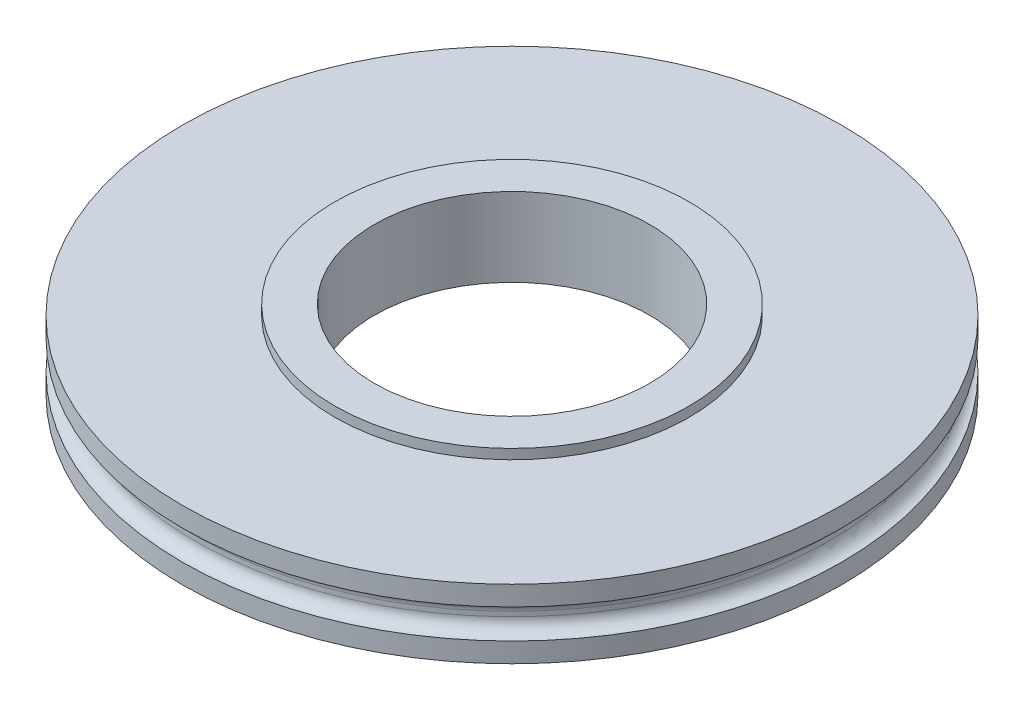
ISO-10303-21;
HEADER;
FILE_DESCRIPTION(('STEP AP214'),'2;1');
FILE_NAME('part.step','',(''),(''),'','','');
FILE_SCHEMA(('AUTOMOTIVE_DESIGN { 1 0 10303 214 1 1 1 1 }'));
ENDSEC;
DATA;
#1=APPLICATION_CONTEXT('core data for automotive mechanical design processes');
#2=APPLICATION_PROTOCOL_DEFINITION('international standard','automotive_design',2000,#1);
#3=PRODUCT_CONTEXT('',#1,'mechanical');
#4=PRODUCT('Part','Part','',(#3));
#5=PRODUCT_RELATED_PRODUCT_CATEGORY('part','',(#4));
#6=PRODUCT_DEFINITION_FORMATION('','',#4);
#7=PRODUCT_DEFINITION_CONTEXT('part definition',#1,'design');
#8=PRODUCT_DEFINITION('design','',#6,#7);
#9=PRODUCT_DEFINITION_SHAPE('','',#8);
#10=(LENGTH_UNIT() NAMED_UNIT(*) SI_UNIT(.MILLI.,.METRE.));
#11=(NAMED_UNIT(*) PLANE_ANGLE_UNIT() SI_UNIT($,.RADIAN.));
#12=(NAMED_UNIT(*) SI_UNIT($,.STERADIAN.) SOLID_ANGLE_UNIT());
#13=UNCERTAINTY_MEASURE_WITH_UNIT(LENGTH_MEASURE(1.E-05),#10,'distance_accuracy_value','');
#14=(GEOMETRIC_REPRESENTATION_CONTEXT(3) GLOBAL_UNCERTAINTY_ASSIGNED_CONTEXT((#13)) GLOBAL_UNIT_ASSIGNED_CONTEXT((#10,
#11,#12)) REPRESENTATION_CONTEXT('',''));
#15=CARTESIAN_POINT('',(0.,0.,0.));
#16=DIRECTION('',(0.,0.,1.));
#17=DIRECTION('',(1.,0.,0.));
#18=AXIS2_PLACEMENT_3D('',#15,#16,#17);
#19=CARTESIAN_POINT('',(0.,5.55625,0.));
#20=DIRECTION('',(0.,1.,0.));
#21=DIRECTION('',(0.,0.,1.));
#22=AXIS2_PLACEMENT_3D('',#19,#20,#21);
#23=PLANE('',#22);
#24=CARTESIAN_POINT('',(0.,5.55625,0.));
#25=DIRECTION('',(0.,1.,0.));
#26=DIRECTION('',(0.,0.,1.));
#27=AXIS2_PLACEMENT_3D('',#24,#25,#26);
#28=CIRCLE('',#27,26.590625);
#29=CARTESIAN_POINT('',(0.,5.55625,26.590625));
#30=VERTEX_POINT('',#29);
#31=EDGE_CURVE('E50',#30,#30,#28,.T.);
#32=ORIENTED_EDGE('',*,*,#31,.T.);
#33=EDGE_LOOP('',(#32));
#34=FACE_BOUND('',#33,.T.);
#35=CARTESIAN_POINT('',(0.,5.55625,0.));
#36=DIRECTION('',(0.,1.,0.));
#37=DIRECTION('',(0.,0.,1.));
#38=AXIS2_PLACEMENT_3D('',#35,#36,#37);
#39=CIRCLE('',#38,14.2875);
#40=CARTESIAN_POINT('',(0.,5.55625,14.2875));
#41=VERTEX_POINT('',#40);
#42=EDGE_CURVE('E58',#41,#41,#39,.T.);
#43=ORIENTED_EDGE('',*,*,#42,.F.);
#44=EDGE_LOOP('',(#43));
#45=FACE_BOUND('',#44,.T.);
#46=ADVANCED_FACE('F31',(#34,#45),#23,.T.);
#47=CARTESIAN_POINT('',(0.,1.5875,0.));
#48=DIRECTION('',(0.,-1.,0.));
#49=DIRECTION('',(0.,0.,-1.));
#50=AXIS2_PLACEMENT_3D('',#47,#48,#49);
#51=CYLINDRICAL_SURFACE('',#50,26.590625);
#52=CARTESIAN_POINT('',(0.,1.5875,0.));
#53=DIRECTION('',(0.,1.,0.));
#54=DIRECTION('',(0.,0.,1.));
#55=AXIS2_PLACEMENT_3D('',#52,#53,#54);
#56=CIRCLE('',#55,26.590625);
#57=CARTESIAN_POINT('',(0.,1.5875,26.590625));
#58=VERTEX_POINT('',#57);
#59=EDGE_CURVE('E42',#58,#58,#56,.T.);
#60=ORIENTED_EDGE('',*,*,#59,.F.);
#61=EDGE_LOOP('',(#60));
#62=FACE_BOUND('',#61,.T.);
#63=CARTESIAN_POINT('',(0.,0.,0.));
#64=DIRECTION('',(0.,1.,0.));
#65=DIRECTION('',(0.,0.,1.));
#66=AXIS2_PLACEMENT_3D('',#63,#64,#65);
#67=CIRCLE('',#66,26.590625);
#68=CARTESIAN_POINT('',(0.,0.,26.590625));
#69=VERTEX_POINT('',#68);
#70=EDGE_CURVE('E46',#69,#69,#67,.T.);
#71=ORIENTED_EDGE('',*,*,#70,.T.);
#72=EDGE_LOOP('',(#71));
#73=FACE_BOUND('',#72,.T.);
#74=ADVANCED_FACE('F94',(#62,#73),#51,.T.);
#75=CARTESIAN_POINT('',(0.,0.,0.));
#76=DIRECTION('',(0.,1.,0.));
#77=DIRECTION('',(0.,0.,1.));
#78=AXIS2_PLACEMENT_3D('',#75,#76,#77);
#79=PLANE('',#78);
#80=CARTESIAN_POINT('',(0.,0.,0.));
#81=DIRECTION('',(0.,1.,0.));
#82=DIRECTION('',(0.,0.,1.));
#83=AXIS2_PLACEMENT_3D('',#80,#81,#82);
#84=CIRCLE('',#83,11.1125);
#85=CARTESIAN_POINT('',(0.,0.,11.1125));
#86=VERTEX_POINT('',#85);
#87=EDGE_CURVE('E61',#86,#86,#84,.T.);
#88=ORIENTED_EDGE('',*,*,#87,.T.);
#89=EDGE_LOOP('',(#88));
#90=FACE_BOUND('',#89,.T.);
#91=ORIENTED_EDGE('',*,*,#70,.F.);
#92=EDGE_LOOP('',(#91));
#93=FACE_BOUND('',#92,.T.);
#94=ADVANCED_FACE('F70',(#90,#93),#79,.F.);
#95=CARTESIAN_POINT('',(0.,3.96875,0.));
#96=DIRECTION('',(0.,-1.,0.));
#97=DIRECTION('',(0.,0.,-1.));
#98=AXIS2_PLACEMENT_3D('',#95,#96,#97);
#99=CYLINDRICAL_SURFACE('',#98,25.5984375);
#100=CARTESIAN_POINT('',(0.,2.9687805180438,0.));
#101=DIRECTION('',(0.,1.,0.));
#102=DIRECTION('',(0.,0.,1.));
#103=AXIS2_PLACEMENT_3D('',#100,#101,#102);
#104=CIRCLE('',#103,25.5984375);
#105=CARTESIAN_POINT('',(0.,2.9687805180438,-25.5984375));
#106=VERTEX_POINT('',#105);
#107=EDGE_CURVE('E10',#106,#106,#104,.F.);
#108=CARTESIAN_POINT('',(0.,2.5874694819562,0.));
#109=DIRECTION('',(0.,-1.,0.));
#110=DIRECTION('',(0.,0.,-1.));
#111=AXIS2_PLACEMENT_3D('',#108,#109,#110);
#112=CIRCLE('',#111,25.5984375);
#113=CARTESIAN_POINT('',(0.,2.5874694819562,-25.5984375));
#114=VERTEX_POINT('',#113);
#115=EDGE_CURVE('E38',#114,#114,#112,.F.);
#116=CARTESIAN_POINT('',(0.,2.9687805180438,-25.5984375));
#117=CARTESIAN_POINT('',(0.,2.96480852808455,-25.5984375));
#118=CARTESIAN_POINT('',(0.,2.96083653812531,-25.5984375));
#119=CARTESIAN_POINT('',(0.,2.95289255820682,-25.5984375));
#120=CARTESIAN_POINT('',(0.,2.94892056824757,-25.5984375));
#121=CARTESIAN_POINT('',(0.,2.94097658832908,-25.5984375));
#122=CARTESIAN_POINT('',(0.,2.93700459836983,-25.5984375));
#123=CARTESIAN_POINT('',(0.,2.92906061845134,-25.5984375));
#124=CARTESIAN_POINT('',(0.,2.9250886284921,-25.5984375));
#125=CARTESIAN_POINT('',(0.,2.9171446485736,-25.5984375));
#126=CARTESIAN_POINT('',(0.,2.91317265861436,-25.5984375));
#127=CARTESIAN_POINT('',(0.,2.90522867869587,-25.5984375));
#128=CARTESIAN_POINT('',(0.,2.90125668873662,-25.5984375));
#129=CARTESIAN_POINT('',(0.,2.89331270881813,-25.5984375));
#130=CARTESIAN_POINT('',(0.,2.88934071885888,-25.5984375));
#131=CARTESIAN_POINT('',(0.,2.88139673894039,-25.5984375));
#132=CARTESIAN_POINT('',(0.,2.87742474898115,-25.5984375));
#133=CARTESIAN_POINT('',(0.,2.86948076906265,-25.5984375));
#134=CARTESIAN_POINT('',(0.,2.86550877910341,-25.5984375));
#135=CARTESIAN_POINT('',(0.,2.85756479918492,-25.5984375));
#136=CARTESIAN_POINT('',(0.,2.85359280922567,-25.5984375));
#137=CARTESIAN_POINT('',(0.,2.84564882930718,-25.5984375));
#138=CARTESIAN_POINT('',(0.,2.84167683934793,-25.5984375));
#139=CARTESIAN_POINT('',(0.,2.83373285942944,-25.5984375));
#140=CARTESIAN_POINT('',(0.,2.8297608694702,-25.5984375));
#141=CARTESIAN_POINT('',(0.,2.8218168895517,-25.5984375));
#142=CARTESIAN_POINT('',(0.,2.81784489959246,-25.5984375));
#143=CARTESIAN_POINT('',(0.,2.80990091967397,-25.5984375));
#144=CARTESIAN_POINT('',(0.,2.80592892971472,-25.5984375));
#145=CARTESIAN_POINT('',(0.,2.79798494979623,-25.5984375));
#146=CARTESIAN_POINT('',(0.,2.79401295983698,-25.5984375));
#147=CARTESIAN_POINT('',(0.,2.78606897991849,-25.5984375));
#148=CARTESIAN_POINT('',(0.,2.78209698995925,-25.5984375));
#149=CARTESIAN_POINT('',(0.,2.77415301004075,-25.5984375));
#150=CARTESIAN_POINT('',(0.,2.77018102008151,-25.5984375));
#151=CARTESIAN_POINT('',(0.,2.76223704016302,-25.5984375));
#152=CARTESIAN_POINT('',(0.,2.75826505020377,-25.5984375));
#153=CARTESIAN_POINT('',(0.,2.75032107028528,-25.5984375));
#154=CARTESIAN_POINT('',(0.,2.74634908032603,-25.5984375));
#155=CARTESIAN_POINT('',(0.,2.73840510040754,-25.5984375));
#156=CARTESIAN_POINT('',(0.,2.7344331104483,-25.5984375));
#157=CARTESIAN_POINT('',(0.,2.7264891305298,-25.5984375));
#158=CARTESIAN_POINT('',(0.,2.72251714057056,-25.5984375));
#159=CARTESIAN_POINT('',(0.,2.71457316065207,-25.5984375));
#160=CARTESIAN_POINT('',(0.,2.71060117069282,-25.5984375));
#161=CARTESIAN_POINT('',(0.,2.70265719077433,-25.5984375));
#162=CARTESIAN_POINT('',(0.,2.69868520081508,-25.5984375));
#163=CARTESIAN_POINT('',(0.,2.69074122089659,-25.5984375));
#164=CARTESIAN_POINT('',(0.,2.68676923093735,-25.5984375));
#165=CARTESIAN_POINT('',(0.,2.67882525101885,-25.5984375));
#166=CARTESIAN_POINT('',(0.,2.67485326105961,-25.5984375));
#167=CARTESIAN_POINT('',(0.,2.66690928114112,-25.5984375));
#168=CARTESIAN_POINT('',(0.,2.66293729118187,-25.5984375));
#169=CARTESIAN_POINT('',(0.,2.65499331126338,-25.5984375));
#170=CARTESIAN_POINT('',(0.,2.65102132130413,-25.5984375));
#171=CARTESIAN_POINT('',(0.,2.64307734138564,-25.5984375));
#172=CARTESIAN_POINT('',(0.,2.63910535142639,-25.5984375));
#173=CARTESIAN_POINT('',(0.,2.6311613715079,-25.5984375));
#174=CARTESIAN_POINT('',(0.,2.62718938154866,-25.5984375));
#175=CARTESIAN_POINT('',(0.,2.61924540163017,-25.5984375));
#176=CARTESIAN_POINT('',(0.,2.61527341167092,-25.5984375));
#177=CARTESIAN_POINT('',(0.,2.60732943175243,-25.5984375));
#178=CARTESIAN_POINT('',(0.,2.60335744179318,-25.5984375));
#179=CARTESIAN_POINT('',(0.,2.59541346187469,-25.5984375));
#180=CARTESIAN_POINT('',(0.,2.59144147191545,-25.5984375));
#181=CARTESIAN_POINT('',(0.,2.5874694819562,-25.5984375));
#182=B_SPLINE_CURVE_WITH_KNOTS('',3,(#116,#117,#118,#119,#120,#121,#122,#123,#124,#125,#126,
#127,#128,#129,#130,#131,#132,#133,#134,#135,#136,#137,#138,#139,#140,#141,#142,#143,#144,#145,
#146,#147,#148,#149,#150,#151,#152,#153,#154,#155,#156,#157,#158,#159,#160,#161,#162,#163,#164,
#165,#166,#167,#168,#169,#170,#171,#172,#173,#174,#175,#176,#177,#178,#179,#180,#181),
.UNSPECIFIED.,.F.,.F.,(4,2,2,2,2,2,2,2,2,2,2,2,2,2,2,2,2,2,2,2,2,2,2,2,2,2,2,2,2,2,2,2,4),(0.,
0.0119159698777375,0.023831939755475,0.0357479096332125,0.0476638795109501,0.0595798493886876,
0.0714958192664251,0.0834117891441626,0.0953277590219001,0.107243728899638,0.119159698777376,
0.131075668655113,0.142991638532851,0.154907608410588,0.166823578288326,0.178739548166063,
0.190655518043801,0.202571487921538,0.214487457799276,0.226403427677013,0.238319397554751,
0.250235367432488,0.262151337310226,0.274067307187964,0.285983277065701,0.297899246943439,
0.309815216821176,0.321731186698914,0.333647156576651,0.345563126454389,0.357479096332126,
0.369395066209864,0.381311036087601),.UNSPECIFIED.);
#183=EDGE_CURVE('BSEAM105',#106,#114,#182,.T.);
#184=ORIENTED_EDGE('',*,*,#107,.T.);
#185=ORIENTED_EDGE('',*,*,#115,.T.);
#186=ORIENTED_EDGE('',*,*,#183,.T.);
#187=ORIENTED_EDGE('',*,*,#183,.F.);
#188=EDGE_LOOP('',(#184,#186,#185,#187));
#189=FACE_BOUND('',#188,.T.);
#190=ADVANCED_FACE('F105',(#189),#99,.T.);
#191=CARTESIAN_POINT('',(0.,5.55625,0.));
#192=DIRECTION('',(0.,-1.,0.));
#193=DIRECTION('',(0.,0.,-1.));
#194=AXIS2_PLACEMENT_3D('',#191,#192,#193);
#195=CYLINDRICAL_SURFACE('',#194,26.590625);
#196=ORIENTED_EDGE('',*,*,#31,.F.);
#197=EDGE_LOOP('',(#196));
#198=FACE_BOUND('',#197,.T.);
#199=CARTESIAN_POINT('',(0.,3.96875,0.));
#200=DIRECTION('',(0.,1.,0.));
#201=DIRECTION('',(0.,0.,1.));
#202=AXIS2_PLACEMENT_3D('',#199,#200,#201);
#203=CIRCLE('',#202,26.590625);
#204=CARTESIAN_POINT('',(0.,3.96875,26.590625));
#205=VERTEX_POINT('',#204);
#206=EDGE_CURVE('E52',#205,#205,#203,.T.);
#207=ORIENTED_EDGE('',*,*,#206,.T.);
#208=EDGE_LOOP('',(#207));
#209=FACE_BOUND('',#208,.T.);
#210=ADVANCED_FACE('F89',(#198,#209),#195,.T.);
#211=CARTESIAN_POINT('',(0.,6.35,0.));
#212=DIRECTION('',(0.,-1.,0.));
#213=DIRECTION('',(0.,0.,-1.));
#214=AXIS2_PLACEMENT_3D('',#211,#212,#213);
#215=CYLINDRICAL_SURFACE('',#214,14.2875);
#216=CARTESIAN_POINT('',(0.,6.35,0.));
#217=DIRECTION('',(0.,1.,0.));
#218=DIRECTION('',(0.,0.,1.));
#219=AXIS2_PLACEMENT_3D('',#216,#217,#218);
#220=CIRCLE('',#219,14.2875);
#221=CARTESIAN_POINT('',(0.,6.35,14.2875));
#222=VERTEX_POINT('',#221);
#223=EDGE_CURVE('E55',#222,#222,#220,.T.);
#224=ORIENTED_EDGE('',*,*,#223,.F.);
#225=EDGE_LOOP('',(#224));
#226=FACE_BOUND('',#225,.T.);
#227=ORIENTED_EDGE('',*,*,#42,.T.);
#228=EDGE_LOOP('',(#227));
#229=FACE_BOUND('',#228,.T.);
#230=ADVANCED_FACE('F83',(#226,#229),#215,.T.);
#231=CARTESIAN_POINT('',(0.,6.35,0.));
#232=DIRECTION('',(0.,1.,0.));
#233=DIRECTION('',(0.,0.,1.));
#234=AXIS2_PLACEMENT_3D('',#231,#232,#233);
#235=PLANE('',#234);
#236=CARTESIAN_POINT('',(0.,6.35,0.));
#237=DIRECTION('',(0.,1.,0.));
#238=DIRECTION('',(0.,0.,1.));
#239=AXIS2_PLACEMENT_3D('',#236,#237,#238);
#240=CIRCLE('',#239,11.1125);
#241=CARTESIAN_POINT('',(0.,6.35,11.1125));
#242=VERTEX_POINT('',#241);
#243=EDGE_CURVE('E64',#242,#242,#240,.T.);
#244=ORIENTED_EDGE('',*,*,#243,.F.);
#245=EDGE_LOOP('',(#244));
#246=FACE_BOUND('',#245,.T.);
#247=ORIENTED_EDGE('',*,*,#223,.T.);
#248=EDGE_LOOP('',(#247));
#249=FACE_BOUND('',#248,.T.);
#250=ADVANCED_FACE('F77',(#246,#249),#235,.T.);
#251=CARTESIAN_POINT('',(0.,0.,0.));
#252=DIRECTION('',(0.,1.,0.));
#253=DIRECTION('',(0.,0.,1.));
#254=AXIS2_PLACEMENT_3D('',#251,#252,#253);
#255=CYLINDRICAL_SURFACE('',#254,11.1125);
#256=ORIENTED_EDGE('',*,*,#87,.F.);
#257=EDGE_LOOP('',(#256));
#258=FACE_BOUND('',#257,.T.);
#259=ORIENTED_EDGE('',*,*,#243,.T.);
#260=EDGE_LOOP('',(#259));
#261=FACE_BOUND('',#260,.T.);
#262=ADVANCED_FACE('F73',(#258,#261),#255,.F.);
#263=CARTESIAN_POINT('',(0.,2.5874694819562,0.));
#264=DIRECTION('',(0.,-1.,0.));
#265=DIRECTION('',(0.,0.,-1.));
#266=AXIS2_PLACEMENT_3D('',#263,#264,#265);
#267=TOROIDAL_SURFACE('',#266,26.5984375,1.);
#268=ORIENTED_EDGE('',*,*,#59,.T.);
#269=EDGE_LOOP('',(#268));
#270=FACE_BOUND('',#269,.T.);
#271=ORIENTED_EDGE('',*,*,#115,.F.);
#272=EDGE_LOOP('',(#271));
#273=FACE_BOUND('',#272,.T.);
#274=ADVANCED_FACE('F76',(#270,#273),#267,.F.);
#275=CARTESIAN_POINT('',(0.,2.9687805180438,0.));
#276=DIRECTION('',(0.,1.,0.));
#277=DIRECTION('',(0.,0.,1.));
#278=AXIS2_PLACEMENT_3D('',#275,#276,#277);
#279=TOROIDAL_SURFACE('',#278,26.5984375,1.);
#280=ORIENTED_EDGE('',*,*,#107,.F.);
#281=EDGE_LOOP('',(#280));
#282=FACE_BOUND('',#281,.T.);
#283=ORIENTED_EDGE('',*,*,#206,.F.);
#284=EDGE_LOOP('',(#283));
#285=FACE_BOUND('',#284,.T.);
#286=ADVANCED_FACE('F33',(#282,#285),#279,.F.);
#287=CLOSED_SHELL('',(#46,#74,#94,#190,#210,#230,#250,#262,#274,#286));
#288=MANIFOLD_SOLID_BREP('B2',#287);
#289=ADVANCED_BREP_SHAPE_REPRESENTATION('',(#18,#288),#14);
#290=SHAPE_DEFINITION_REPRESENTATION(#9,#289);
ENDSEC;
END-ISO-10303-21;
